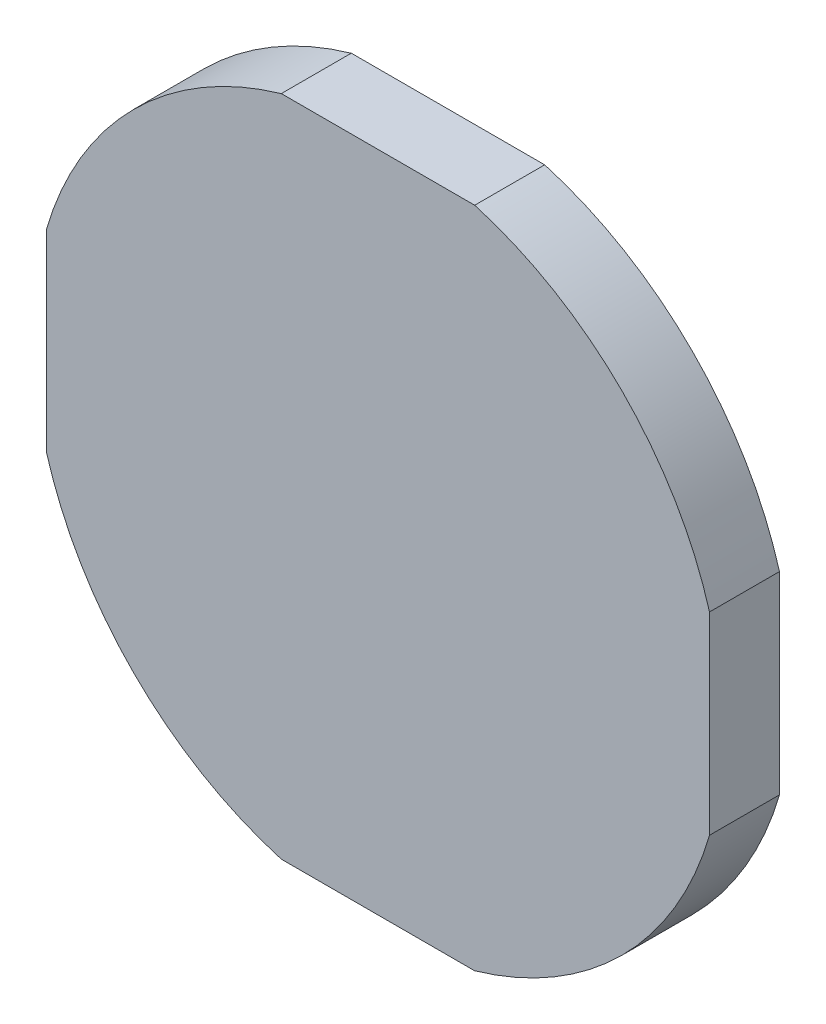
ISO-10303-21;
HEADER;
FILE_DESCRIPTION(('STEP AP214'),'2;1');
FILE_NAME('part.step','',(''),(''),'','','');
FILE_SCHEMA(('AUTOMOTIVE_DESIGN { 1 0 10303 214 1 1 1 1 }'));
ENDSEC;
DATA;
#1=APPLICATION_CONTEXT('core data for automotive mechanical design processes');
#2=APPLICATION_PROTOCOL_DEFINITION('international standard','automotive_design',2000,#1);
#3=PRODUCT_CONTEXT('',#1,'mechanical');
#4=PRODUCT('Part','Part','',(#3));
#5=PRODUCT_RELATED_PRODUCT_CATEGORY('part','',(#4));
#6=PRODUCT_DEFINITION_FORMATION('','',#4);
#7=PRODUCT_DEFINITION_CONTEXT('part definition',#1,'design');
#8=PRODUCT_DEFINITION('design','',#6,#7);
#9=PRODUCT_DEFINITION_SHAPE('','',#8);
#10=(LENGTH_UNIT() NAMED_UNIT(*) SI_UNIT(.MILLI.,.METRE.));
#11=(NAMED_UNIT(*) PLANE_ANGLE_UNIT() SI_UNIT($,.RADIAN.));
#12=(NAMED_UNIT(*) SI_UNIT($,.STERADIAN.) SOLID_ANGLE_UNIT());
#13=UNCERTAINTY_MEASURE_WITH_UNIT(LENGTH_MEASURE(1.E-05),#10,'distance_accuracy_value','');
#14=(GEOMETRIC_REPRESENTATION_CONTEXT(3) GLOBAL_UNCERTAINTY_ASSIGNED_CONTEXT((#13)) GLOBAL_UNIT_ASSIGNED_CONTEXT((#10,
#11,#12)) REPRESENTATION_CONTEXT('',''));
#15=CARTESIAN_POINT('',(0.,0.,0.));
#16=DIRECTION('',(0.,0.,1.));
#17=DIRECTION('',(1.,0.,0.));
#18=AXIS2_PLACEMENT_3D('',#15,#16,#17);
#19=CARTESIAN_POINT('',(0.,0.,-0.9652));
#20=DIRECTION('',(0.,0.,1.));
#21=DIRECTION('',(1.,0.,0.));
#22=AXIS2_PLACEMENT_3D('',#19,#20,#21);
#23=CYLINDRICAL_SURFACE('',#22,4.7625);
#24=CARTESIAN_POINT('',(0.,0.,0.));
#25=DIRECTION('',(0.,0.,1.));
#26=DIRECTION('',(1.,0.,0.));
#27=AXIS2_PLACEMENT_3D('',#24,#25,#26);
#28=CIRCLE('',#27,4.7625);
#29=CARTESIAN_POINT('',(-1.33350000000004,4.572,0.));
#30=VERTEX_POINT('',#29);
#31=CARTESIAN_POINT('',(-4.57199999999999,1.33350000000004,0.));
#32=VERTEX_POINT('',#31);
#33=EDGE_CURVE('E573',#30,#32,#28,.T.);
#34=ORIENTED_EDGE('',*,*,#33,.F.);
#35=DIRECTION('',(0.,0.,1.));
#36=VECTOR('',#35,1.);
#37=CARTESIAN_POINT('',(-1.33350000000004,4.572,-0.9652));
#38=LINE('',#37,#36);
#39=CARTESIAN_POINT('',(-1.33350000000004,4.572,-0.9652));
#40=VERTEX_POINT('',#39);
#41=EDGE_CURVE('E11',#40,#30,#38,.T.);
#42=ORIENTED_EDGE('',*,*,#41,.F.);
#43=CARTESIAN_POINT('',(0.,0.,-0.9652));
#44=DIRECTION('',(0.,0.,1.));
#45=DIRECTION('',(1.,0.,0.));
#46=AXIS2_PLACEMENT_3D('',#43,#44,#45);
#47=CIRCLE('',#46,4.7625);
#48=CARTESIAN_POINT('',(-4.57199999999999,1.33350000000004,-0.9652));
#49=VERTEX_POINT('',#48);
#50=EDGE_CURVE('E583',#40,#49,#47,.T.);
#51=ORIENTED_EDGE('',*,*,#50,.T.);
#52=DIRECTION('',(0.,0.,1.));
#53=VECTOR('',#52,1.);
#54=CARTESIAN_POINT('',(-4.57199999999999,1.33350000000004,-0.9652));
#55=LINE('',#54,#53);
#56=EDGE_CURVE('E43',#49,#32,#55,.T.);
#57=ORIENTED_EDGE('',*,*,#56,.T.);
#58=EDGE_LOOP('',(#34,#42,#51,#57));
#59=FACE_BOUND('',#58,.T.);
#60=ADVANCED_FACE('F40',(#59),#23,.T.);
#61=CARTESIAN_POINT('',(-1.33350000000004,4.572,-0.9652));
#62=DIRECTION('',(0.,1.,0.));
#63=DIRECTION('',(0.,0.,1.));
#64=AXIS2_PLACEMENT_3D('',#61,#62,#63);
#65=PLANE('',#64);
#66=DIRECTION('',(-1.,0.,0.));
#67=VECTOR('',#66,1.);
#68=CARTESIAN_POINT('',(-1.33350000000004,4.572,0.));
#69=LINE('',#68,#67);
#70=CARTESIAN_POINT('',(1.33350000000004,4.572,0.));
#71=VERTEX_POINT('',#70);
#72=EDGE_CURVE('E588',#71,#30,#69,.T.);
#73=ORIENTED_EDGE('',*,*,#72,.F.);
#74=DIRECTION('',(0.,0.,1.));
#75=VECTOR('',#74,1.);
#76=CARTESIAN_POINT('',(1.33350000000004,4.572,-0.9652));
#77=LINE('',#76,#75);
#78=CARTESIAN_POINT('',(1.33350000000004,4.572,-0.9652));
#79=VERTEX_POINT('',#78);
#80=EDGE_CURVE('E49',#79,#71,#77,.T.);
#81=ORIENTED_EDGE('',*,*,#80,.F.);
#82=DIRECTION('',(-1.,0.,0.));
#83=VECTOR('',#82,1.);
#84=CARTESIAN_POINT('',(-1.33350000000004,4.572,-0.9652));
#85=LINE('',#84,#83);
#86=EDGE_CURVE('E612',#79,#40,#85,.T.);
#87=ORIENTED_EDGE('',*,*,#86,.T.);
#88=ORIENTED_EDGE('',*,*,#41,.T.);
#89=EDGE_LOOP('',(#73,#81,#87,#88));
#90=FACE_BOUND('',#89,.T.);
#91=ADVANCED_FACE('F675',(#90),#65,.T.);
#92=CARTESIAN_POINT('',(0.,0.,-0.9652));
#93=DIRECTION('',(0.,0.,1.));
#94=DIRECTION('',(1.,0.,0.));
#95=AXIS2_PLACEMENT_3D('',#92,#93,#94);
#96=CYLINDRICAL_SURFACE('',#95,4.7625);
#97=CARTESIAN_POINT('',(0.,0.,0.));
#98=DIRECTION('',(0.,0.,1.));
#99=DIRECTION('',(1.,0.,0.));
#100=AXIS2_PLACEMENT_3D('',#97,#98,#99);
#101=CIRCLE('',#100,4.7625);
#102=CARTESIAN_POINT('',(4.57199999999999,1.33350000000004,0.));
#103=VERTEX_POINT('',#102);
#104=EDGE_CURVE('E639',#103,#71,#101,.T.);
#105=ORIENTED_EDGE('',*,*,#104,.F.);
#106=DIRECTION('',(0.,0.,1.));
#107=VECTOR('',#106,1.);
#108=CARTESIAN_POINT('',(4.57199999999999,1.33350000000004,-0.9652));
#109=LINE('',#108,#107);
#110=CARTESIAN_POINT('',(4.57199999999999,1.33350000000004,-0.9652));
#111=VERTEX_POINT('',#110);
#112=EDGE_CURVE('E648',#111,#103,#109,.T.);
#113=ORIENTED_EDGE('',*,*,#112,.F.);
#114=CARTESIAN_POINT('',(0.,0.,-0.9652));
#115=DIRECTION('',(0.,0.,1.));
#116=DIRECTION('',(1.,0.,0.));
#117=AXIS2_PLACEMENT_3D('',#114,#115,#116);
#118=CIRCLE('',#117,4.7625);
#119=EDGE_CURVE('E608',#111,#79,#118,.T.);
#120=ORIENTED_EDGE('',*,*,#119,.T.);
#121=ORIENTED_EDGE('',*,*,#80,.T.);
#122=EDGE_LOOP('',(#105,#113,#120,#121));
#123=FACE_BOUND('',#122,.T.);
#124=ADVANCED_FACE('F696',(#123),#96,.T.);
#125=CARTESIAN_POINT('',(4.57199999999999,1.33350000000004,-0.9652));
#126=DIRECTION('',(1.,0.,0.));
#127=DIRECTION('',(0.,0.,-1.));
#128=AXIS2_PLACEMENT_3D('',#125,#126,#127);
#129=PLANE('',#128);
#130=DIRECTION('',(0.,1.,0.));
#131=VECTOR('',#130,1.);
#132=CARTESIAN_POINT('',(4.57199999999999,1.33350000000004,0.));
#133=LINE('',#132,#131);
#134=CARTESIAN_POINT('',(4.57199999999999,-1.33350000000004,0.));
#135=VERTEX_POINT('',#134);
#136=EDGE_CURVE('E635',#135,#103,#133,.T.);
#137=ORIENTED_EDGE('',*,*,#136,.F.);
#138=DIRECTION('',(0.,0.,1.));
#139=VECTOR('',#138,1.);
#140=CARTESIAN_POINT('',(4.57199999999999,-1.33350000000004,-0.9652));
#141=LINE('',#140,#139);
#142=CARTESIAN_POINT('',(4.57199999999999,-1.33350000000004,-0.9652));
#143=VERTEX_POINT('',#142);
#144=EDGE_CURVE('E651',#143,#135,#141,.T.);
#145=ORIENTED_EDGE('',*,*,#144,.F.);
#146=DIRECTION('',(0.,1.,0.));
#147=VECTOR('',#146,1.);
#148=CARTESIAN_POINT('',(4.57199999999999,1.33350000000004,-0.9652));
#149=LINE('',#148,#147);
#150=EDGE_CURVE('E604',#143,#111,#149,.T.);
#151=ORIENTED_EDGE('',*,*,#150,.T.);
#152=ORIENTED_EDGE('',*,*,#112,.T.);
#153=EDGE_LOOP('',(#137,#145,#151,#152));
#154=FACE_BOUND('',#153,.T.);
#155=ADVANCED_FACE('F694',(#154),#129,.T.);
#156=CARTESIAN_POINT('',(0.,0.,-0.9652));
#157=DIRECTION('',(0.,0.,1.));
#158=DIRECTION('',(1.,0.,0.));
#159=AXIS2_PLACEMENT_3D('',#156,#157,#158);
#160=CYLINDRICAL_SURFACE('',#159,4.7625);
#161=CARTESIAN_POINT('',(0.,0.,0.));
#162=DIRECTION('',(0.,0.,1.));
#163=DIRECTION('',(1.,0.,0.));
#164=AXIS2_PLACEMENT_3D('',#161,#162,#163);
#165=CIRCLE('',#164,4.7625);
#166=CARTESIAN_POINT('',(1.33350000000003,-4.57199999999999,0.));
#167=VERTEX_POINT('',#166);
#168=EDGE_CURVE('E631',#167,#135,#165,.T.);
#169=ORIENTED_EDGE('',*,*,#168,.F.);
#170=DIRECTION('',(0.,0.,1.));
#171=VECTOR('',#170,1.);
#172=CARTESIAN_POINT('',(1.33350000000003,-4.57199999999999,-0.9652));
#173=LINE('',#172,#171);
#174=CARTESIAN_POINT('',(1.33350000000003,-4.57199999999999,-0.9652));
#175=VERTEX_POINT('',#174);
#176=EDGE_CURVE('E654',#175,#167,#173,.T.);
#177=ORIENTED_EDGE('',*,*,#176,.F.);
#178=CARTESIAN_POINT('',(0.,0.,-0.9652));
#179=DIRECTION('',(0.,0.,1.));
#180=DIRECTION('',(1.,0.,0.));
#181=AXIS2_PLACEMENT_3D('',#178,#179,#180);
#182=CIRCLE('',#181,4.7625);
#183=EDGE_CURVE('E600',#175,#143,#182,.T.);
#184=ORIENTED_EDGE('',*,*,#183,.T.);
#185=ORIENTED_EDGE('',*,*,#144,.T.);
#186=EDGE_LOOP('',(#169,#177,#184,#185));
#187=FACE_BOUND('',#186,.T.);
#188=ADVANCED_FACE('F690',(#187),#160,.T.);
#189=CARTESIAN_POINT('',(1.33350000000004,-4.572,-0.9652));
#190=DIRECTION('',(0.,-1.,0.));
#191=DIRECTION('',(0.,0.,-1.));
#192=AXIS2_PLACEMENT_3D('',#189,#190,#191);
#193=PLANE('',#192);
#194=DIRECTION('',(1.,0.,0.));
#195=VECTOR('',#194,1.);
#196=CARTESIAN_POINT('',(1.33350000000004,-4.572,0.));
#197=LINE('',#196,#195);
#198=CARTESIAN_POINT('',(-1.33350000000004,-4.572,0.));
#199=VERTEX_POINT('',#198);
#200=EDGE_CURVE('E627',#199,#167,#197,.T.);
#201=ORIENTED_EDGE('',*,*,#200,.F.);
#202=DIRECTION('',(0.,0.,1.));
#203=VECTOR('',#202,1.);
#204=CARTESIAN_POINT('',(-1.33350000000004,-4.572,-0.9652));
#205=LINE('',#204,#203);
#206=CARTESIAN_POINT('',(-1.33350000000004,-4.572,-0.9652));
#207=VERTEX_POINT('',#206);
#208=EDGE_CURVE('E657',#207,#199,#205,.T.);
#209=ORIENTED_EDGE('',*,*,#208,.F.);
#210=DIRECTION('',(1.,0.,0.));
#211=VECTOR('',#210,1.);
#212=CARTESIAN_POINT('',(1.33350000000004,-4.572,-0.9652));
#213=LINE('',#212,#211);
#214=EDGE_CURVE('E596',#207,#175,#213,.T.);
#215=ORIENTED_EDGE('',*,*,#214,.T.);
#216=ORIENTED_EDGE('',*,*,#176,.T.);
#217=EDGE_LOOP('',(#201,#209,#215,#216));
#218=FACE_BOUND('',#217,.T.);
#219=ADVANCED_FACE('F688',(#218),#193,.T.);
#220=CARTESIAN_POINT('',(0.,0.,-0.9652));
#221=DIRECTION('',(0.,0.,1.));
#222=DIRECTION('',(1.,0.,0.));
#223=AXIS2_PLACEMENT_3D('',#220,#221,#222);
#224=CYLINDRICAL_SURFACE('',#223,4.7625);
#225=CARTESIAN_POINT('',(0.,0.,0.));
#226=DIRECTION('',(0.,0.,1.));
#227=DIRECTION('',(1.,0.,0.));
#228=AXIS2_PLACEMENT_3D('',#225,#226,#227);
#229=CIRCLE('',#228,4.7625);
#230=CARTESIAN_POINT('',(-4.57199999999999,-1.33350000000004,0.));
#231=VERTEX_POINT('',#230);
#232=EDGE_CURVE('E623',#231,#199,#229,.T.);
#233=ORIENTED_EDGE('',*,*,#232,.F.);
#234=DIRECTION('',(0.,0.,1.));
#235=VECTOR('',#234,1.);
#236=CARTESIAN_POINT('',(-4.57199999999999,-1.33350000000004,-0.9652));
#237=LINE('',#236,#235);
#238=CARTESIAN_POINT('',(-4.57199999999999,-1.33350000000004,-0.9652));
#239=VERTEX_POINT('',#238);
#240=EDGE_CURVE('E659',#239,#231,#237,.T.);
#241=ORIENTED_EDGE('',*,*,#240,.F.);
#242=CARTESIAN_POINT('',(0.,0.,-0.9652));
#243=DIRECTION('',(0.,0.,1.));
#244=DIRECTION('',(1.,0.,0.));
#245=AXIS2_PLACEMENT_3D('',#242,#243,#244);
#246=CIRCLE('',#245,4.7625);
#247=EDGE_CURVE('E592',#239,#207,#246,.T.);
#248=ORIENTED_EDGE('',*,*,#247,.T.);
#249=ORIENTED_EDGE('',*,*,#208,.T.);
#250=EDGE_LOOP('',(#233,#241,#248,#249));
#251=FACE_BOUND('',#250,.T.);
#252=ADVANCED_FACE('F684',(#251),#224,.T.);
#253=CARTESIAN_POINT('',(-4.57199999999999,1.33350000000004,-0.9652));
#254=DIRECTION('',(-1.,0.,0.));
#255=DIRECTION('',(0.,0.,1.));
#256=AXIS2_PLACEMENT_3D('',#253,#254,#255);
#257=PLANE('',#256);
#258=DIRECTION('',(0.,-1.,0.));
#259=VECTOR('',#258,1.);
#260=CARTESIAN_POINT('',(-4.57199999999999,1.33350000000004,0.));
#261=LINE('',#260,#259);
#262=EDGE_CURVE('E619',#32,#231,#261,.T.);
#263=ORIENTED_EDGE('',*,*,#262,.F.);
#264=ORIENTED_EDGE('',*,*,#56,.F.);
#265=DIRECTION('',(0.,-1.,0.));
#266=VECTOR('',#265,1.);
#267=CARTESIAN_POINT('',(-4.57199999999999,1.33350000000004,-0.9652));
#268=LINE('',#267,#266);
#269=EDGE_CURVE('E587',#49,#239,#268,.T.);
#270=ORIENTED_EDGE('',*,*,#269,.T.);
#271=ORIENTED_EDGE('',*,*,#240,.T.);
#272=EDGE_LOOP('',(#263,#264,#270,#271));
#273=FACE_BOUND('',#272,.T.);
#274=ADVANCED_FACE('F669',(#273),#257,.T.);
#275=CARTESIAN_POINT('',(0.,0.,-0.9652));
#276=DIRECTION('',(0.,0.,1.));
#277=DIRECTION('',(1.,0.,0.));
#278=AXIS2_PLACEMENT_3D('',#275,#276,#277);
#279=PLANE('',#278);
#280=DIRECTION('',(-1.,0.,0.));
#281=VECTOR('',#280,1.);
#282=CARTESIAN_POINT('',(-1.375,-3.125,-0.9652));
#283=LINE('',#282,#281);
#284=CARTESIAN_POINT('',(-1.375,-3.125,-0.9652));
#285=VERTEX_POINT('',#284);
#286=CARTESIAN_POINT('',(-2.625,-3.125,-0.9652));
#287=VERTEX_POINT('',#286);
#288=EDGE_CURVE('E351',#285,#287,#283,.T.);
#289=ORIENTED_EDGE('',*,*,#288,.F.);
#290=DIRECTION('',(0.,-1.,0.));
#291=VECTOR('',#290,1.);
#292=CARTESIAN_POINT('',(-1.375,-0.625,-0.9652));
#293=LINE('',#292,#291);
#294=CARTESIAN_POINT('',(-1.375,-0.625,-0.9652));
#295=VERTEX_POINT('',#294);
#296=EDGE_CURVE('E60',#295,#285,#293,.T.);
#297=ORIENTED_EDGE('',*,*,#296,.F.);
#298=DIRECTION('',(1.,0.,0.));
#299=VECTOR('',#298,1.);
#300=CARTESIAN_POINT('',(-1.375,-0.625,-0.9652));
#301=LINE('',#300,#299);
#302=CARTESIAN_POINT('',(-2.625,-0.625,-0.9652));
#303=VERTEX_POINT('',#302);
#304=EDGE_CURVE('E337',#303,#295,#301,.T.);
#305=ORIENTED_EDGE('',*,*,#304,.F.);
#306=DIRECTION('',(0.,1.,0.));
#307=VECTOR('',#306,1.);
#308=CARTESIAN_POINT('',(-2.625,-0.625,-0.9652));
#309=LINE('',#308,#307);
#310=EDGE_CURVE('E343',#287,#303,#309,.T.);
#311=ORIENTED_EDGE('',*,*,#310,.F.);
#312=EDGE_LOOP('',(#289,#297,#305,#311));
#313=FACE_BOUND('',#312,.T.);
#314=DIRECTION('',(-1.,0.,0.));
#315=VECTOR('',#314,1.);
#316=CARTESIAN_POINT('',(0.625,-3.125,-0.9652));
#317=LINE('',#316,#315);
#318=CARTESIAN_POINT('',(0.625,-3.125,-0.9652));
#319=VERTEX_POINT('',#318);
#320=CARTESIAN_POINT('',(-0.625000000000001,-3.125,-0.9652));
#321=VERTEX_POINT('',#320);
#322=EDGE_CURVE('E385',#319,#321,#317,.T.);
#323=ORIENTED_EDGE('',*,*,#322,.F.);
#324=DIRECTION('',(0.,-1.,0.));
#325=VECTOR('',#324,1.);
#326=CARTESIAN_POINT('',(0.624999999999999,-0.625,-0.9652));
#327=LINE('',#326,#325);
#328=CARTESIAN_POINT('',(0.624999999999999,-0.625,-0.9652));
#329=VERTEX_POINT('',#328);
#330=EDGE_CURVE('E71',#329,#319,#327,.T.);
#331=ORIENTED_EDGE('',*,*,#330,.F.);
#332=DIRECTION('',(1.,0.,0.));
#333=VECTOR('',#332,1.);
#334=CARTESIAN_POINT('',(0.624999999999999,-0.625,-0.9652));
#335=LINE('',#334,#333);
#336=CARTESIAN_POINT('',(-0.624999999999999,-0.625,-0.9652));
#337=VERTEX_POINT('',#336);
#338=EDGE_CURVE('E370',#337,#329,#335,.T.);
#339=ORIENTED_EDGE('',*,*,#338,.F.);
#340=DIRECTION('',(0.,1.,0.));
#341=VECTOR('',#340,1.);
#342=CARTESIAN_POINT('',(-0.624999999999999,-0.625,-0.9652));
#343=LINE('',#342,#341);
#344=EDGE_CURVE('E389',#321,#337,#343,.T.);
#345=ORIENTED_EDGE('',*,*,#344,.F.);
#346=EDGE_LOOP('',(#323,#331,#339,#345));
#347=FACE_BOUND('',#346,.T.);
#348=DIRECTION('',(-1.,0.,0.));
#349=VECTOR('',#348,1.);
#350=CARTESIAN_POINT('',(2.625,-3.125,-0.9652));
#351=LINE('',#350,#349);
#352=CARTESIAN_POINT('',(2.625,-3.125,-0.9652));
#353=VERTEX_POINT('',#352);
#354=CARTESIAN_POINT('',(1.375,-3.125,-0.9652));
#355=VERTEX_POINT('',#354);
#356=EDGE_CURVE('E428',#353,#355,#351,.T.);
#357=ORIENTED_EDGE('',*,*,#356,.F.);
#358=DIRECTION('',(0.,-1.,0.));
#359=VECTOR('',#358,1.);
#360=CARTESIAN_POINT('',(2.625,-0.625,-0.9652));
#361=LINE('',#360,#359);
#362=CARTESIAN_POINT('',(2.625,-0.625,-0.9652));
#363=VERTEX_POINT('',#362);
#364=EDGE_CURVE('E399',#363,#353,#361,.T.);
#365=ORIENTED_EDGE('',*,*,#364,.F.);
#366=DIRECTION('',(1.,0.,0.));
#367=VECTOR('',#366,1.);
#368=CARTESIAN_POINT('',(2.625,-0.625,-0.9652));
#369=LINE('',#368,#367);
#370=CARTESIAN_POINT('',(1.375,-0.625,-0.9652));
#371=VERTEX_POINT('',#370);
#372=EDGE_CURVE('E413',#371,#363,#369,.T.);
#373=ORIENTED_EDGE('',*,*,#372,.F.);
#374=DIRECTION('',(0.,1.,0.));
#375=VECTOR('',#374,1.);
#376=CARTESIAN_POINT('',(1.375,-0.625,-0.9652));
#377=LINE('',#376,#375);
#378=EDGE_CURVE('E432',#355,#371,#377,.T.);
#379=ORIENTED_EDGE('',*,*,#378,.F.);
#380=EDGE_LOOP('',(#357,#365,#373,#379));
#381=FACE_BOUND('',#380,.T.);
#382=DIRECTION('',(-1.,0.,0.));
#383=VECTOR('',#382,1.);
#384=CARTESIAN_POINT('',(-1.375,0.625,-0.9652));
#385=LINE('',#384,#383);
#386=CARTESIAN_POINT('',(-1.375,0.625,-0.9652));
#387=VERTEX_POINT('',#386);
#388=CARTESIAN_POINT('',(-2.625,0.625,-0.9652));
#389=VERTEX_POINT('',#388);
#390=EDGE_CURVE('E472',#387,#389,#385,.T.);
#391=ORIENTED_EDGE('',*,*,#390,.F.);
#392=DIRECTION('',(0.,-1.,0.));
#393=VECTOR('',#392,1.);
#394=CARTESIAN_POINT('',(-1.375,3.125,-0.9652));
#395=LINE('',#394,#393);
#396=CARTESIAN_POINT('',(-1.375,3.125,-0.9652));
#397=VERTEX_POINT('',#396);
#398=EDGE_CURVE('E442',#397,#387,#395,.T.);
#399=ORIENTED_EDGE('',*,*,#398,.F.);
#400=DIRECTION('',(1.,0.,0.));
#401=VECTOR('',#400,1.);
#402=CARTESIAN_POINT('',(-1.375,3.125,-0.9652));
#403=LINE('',#402,#401);
#404=CARTESIAN_POINT('',(-2.625,3.125,-0.9652));
#405=VERTEX_POINT('',#404);
#406=EDGE_CURVE('E457',#405,#397,#403,.T.);
#407=ORIENTED_EDGE('',*,*,#406,.F.);
#408=DIRECTION('',(0.,1.,0.));
#409=VECTOR('',#408,1.);
#410=CARTESIAN_POINT('',(-2.625,3.125,-0.9652));
#411=LINE('',#410,#409);
#412=EDGE_CURVE('E476',#389,#405,#411,.T.);
#413=ORIENTED_EDGE('',*,*,#412,.F.);
#414=EDGE_LOOP('',(#391,#399,#407,#413));
#415=FACE_BOUND('',#414,.T.);
#416=DIRECTION('',(-1.,0.,0.));
#417=VECTOR('',#416,1.);
#418=CARTESIAN_POINT('',(0.625,0.625,-0.9652));
#419=LINE('',#418,#417);
#420=CARTESIAN_POINT('',(0.625,0.625,-0.9652));
#421=VERTEX_POINT('',#420);
#422=CARTESIAN_POINT('',(-0.625,0.625,-0.9652));
#423=VERTEX_POINT('',#422);
#424=EDGE_CURVE('E516',#421,#423,#419,.T.);
#425=ORIENTED_EDGE('',*,*,#424,.F.);
#426=DIRECTION('',(0.,-1.,0.));
#427=VECTOR('',#426,1.);
#428=CARTESIAN_POINT('',(0.625,3.125,-0.9652));
#429=LINE('',#428,#427);
#430=CARTESIAN_POINT('',(0.625,3.125,-0.9652));
#431=VERTEX_POINT('',#430);
#432=EDGE_CURVE('E486',#431,#421,#429,.T.);
#433=ORIENTED_EDGE('',*,*,#432,.F.);
#434=DIRECTION('',(1.,0.,0.));
#435=VECTOR('',#434,1.);
#436=CARTESIAN_POINT('',(0.625,3.125,-0.9652));
#437=LINE('',#436,#435);
#438=CARTESIAN_POINT('',(-0.624999999999999,3.125,-0.9652));
#439=VERTEX_POINT('',#438);
#440=EDGE_CURVE('E501',#439,#431,#437,.T.);
#441=ORIENTED_EDGE('',*,*,#440,.F.);
#442=DIRECTION('',(0.,1.,0.));
#443=VECTOR('',#442,1.);
#444=CARTESIAN_POINT('',(-0.624999999999999,3.125,-0.9652));
#445=LINE('',#444,#443);
#446=EDGE_CURVE('E520',#423,#439,#445,.T.);
#447=ORIENTED_EDGE('',*,*,#446,.F.);
#448=EDGE_LOOP('',(#425,#433,#441,#447));
#449=FACE_BOUND('',#448,.T.);
#450=DIRECTION('',(-1.,0.,0.));
#451=VECTOR('',#450,1.);
#452=CARTESIAN_POINT('',(2.625,0.625,-0.9652));
#453=LINE('',#452,#451);
#454=CARTESIAN_POINT('',(2.625,0.625,-0.9652));
#455=VERTEX_POINT('',#454);
#456=CARTESIAN_POINT('',(1.375,0.625,-0.9652));
#457=VERTEX_POINT('',#456);
#458=EDGE_CURVE('E559',#455,#457,#453,.T.);
#459=ORIENTED_EDGE('',*,*,#458,.F.);
#460=DIRECTION('',(0.,-1.,0.));
#461=VECTOR('',#460,1.);
#462=CARTESIAN_POINT('',(2.625,3.125,-0.9652));
#463=LINE('',#462,#461);
#464=CARTESIAN_POINT('',(2.625,3.125,-0.9652));
#465=VERTEX_POINT('',#464);
#466=EDGE_CURVE('E530',#465,#455,#463,.T.);
#467=ORIENTED_EDGE('',*,*,#466,.F.);
#468=DIRECTION('',(1.,0.,0.));
#469=VECTOR('',#468,1.);
#470=CARTESIAN_POINT('',(2.625,3.125,-0.9652));
#471=LINE('',#470,#469);
#472=CARTESIAN_POINT('',(1.375,3.125,-0.9652));
#473=VERTEX_POINT('',#472);
#474=EDGE_CURVE('E544',#473,#465,#471,.T.);
#475=ORIENTED_EDGE('',*,*,#474,.F.);
#476=DIRECTION('',(0.,1.,0.));
#477=VECTOR('',#476,1.);
#478=CARTESIAN_POINT('',(1.375,3.125,-0.9652));
#479=LINE('',#478,#477);
#480=EDGE_CURVE('E563',#457,#473,#479,.T.);
#481=ORIENTED_EDGE('',*,*,#480,.F.);
#482=EDGE_LOOP('',(#459,#467,#475,#481));
#483=FACE_BOUND('',#482,.T.);
#484=ORIENTED_EDGE('',*,*,#50,.F.);
#485=ORIENTED_EDGE('',*,*,#86,.F.);
#486=ORIENTED_EDGE('',*,*,#119,.F.);
#487=ORIENTED_EDGE('',*,*,#150,.F.);
#488=ORIENTED_EDGE('',*,*,#183,.F.);
#489=ORIENTED_EDGE('',*,*,#214,.F.);
#490=ORIENTED_EDGE('',*,*,#247,.F.);
#491=ORIENTED_EDGE('',*,*,#269,.F.);
#492=EDGE_LOOP('',(#484,#485,#486,#487,#488,#489,#490,#491));
#493=FACE_BOUND('',#492,.T.);
#494=ADVANCED_FACE('F678',(#313,#347,#381,#415,#449,#483,#493),#279,.F.);
#495=CARTESIAN_POINT('',(0.,0.,0.));
#496=DIRECTION('',(0.,0.,1.));
#497=DIRECTION('',(1.,0.,0.));
#498=AXIS2_PLACEMENT_3D('',#495,#496,#497);
#499=PLANE('',#498);
#500=ORIENTED_EDGE('',*,*,#33,.T.);
#501=ORIENTED_EDGE('',*,*,#262,.T.);
#502=ORIENTED_EDGE('',*,*,#232,.T.);
#503=ORIENTED_EDGE('',*,*,#200,.T.);
#504=ORIENTED_EDGE('',*,*,#168,.T.);
#505=ORIENTED_EDGE('',*,*,#136,.T.);
#506=ORIENTED_EDGE('',*,*,#104,.T.);
#507=ORIENTED_EDGE('',*,*,#72,.T.);
#508=EDGE_LOOP('',(#500,#501,#502,#503,#504,#505,#506,#507));
#509=FACE_BOUND('',#508,.T.);
#510=ADVANCED_FACE('F671',(#509),#499,.T.);
#511=CARTESIAN_POINT('',(2.625,3.125,-0.9398));
#512=DIRECTION('',(1.,0.,0.));
#513=DIRECTION('',(0.,0.,-1.));
#514=AXIS2_PLACEMENT_3D('',#511,#512,#513);
#515=PLANE('',#514);
#516=ORIENTED_EDGE('',*,*,#466,.T.);
#517=DIRECTION('',(0.,0.,-1.));
#518=VECTOR('',#517,1.);
#519=CARTESIAN_POINT('',(2.625,0.625,-0.9398));
#520=LINE('',#519,#518);
#521=CARTESIAN_POINT('',(2.625,0.625,-0.9398));
#522=VERTEX_POINT('',#521);
#523=EDGE_CURVE('E556',#522,#455,#520,.T.);
#524=ORIENTED_EDGE('',*,*,#523,.F.);
#525=DIRECTION('',(0.,-1.,0.));
#526=VECTOR('',#525,1.);
#527=CARTESIAN_POINT('',(2.625,3.125,-0.9398));
#528=LINE('',#527,#526);
#529=CARTESIAN_POINT('',(2.625,3.125,-0.9398));
#530=VERTEX_POINT('',#529);
#531=EDGE_CURVE('E539',#530,#522,#528,.T.);
#532=ORIENTED_EDGE('',*,*,#531,.F.);
#533=DIRECTION('',(0.,0.,-1.));
#534=VECTOR('',#533,1.);
#535=CARTESIAN_POINT('',(2.625,3.125,-0.9398));
#536=LINE('',#535,#534);
#537=EDGE_CURVE('E570',#530,#465,#536,.T.);
#538=ORIENTED_EDGE('',*,*,#537,.T.);
#539=EDGE_LOOP('',(#516,#524,#532,#538));
#540=FACE_BOUND('',#539,.T.);
#541=ADVANCED_FACE('F767',(#540),#515,.F.);
#542=CARTESIAN_POINT('',(2.625,3.125,-0.9398));
#543=DIRECTION('',(0.,1.,0.));
#544=DIRECTION('',(0.,0.,1.));
#545=AXIS2_PLACEMENT_3D('',#542,#543,#544);
#546=PLANE('',#545);
#547=ORIENTED_EDGE('',*,*,#474,.T.);
#548=ORIENTED_EDGE('',*,*,#537,.F.);
#549=DIRECTION('',(1.,0.,0.));
#550=VECTOR('',#549,1.);
#551=CARTESIAN_POINT('',(2.625,3.125,-0.9398));
#552=LINE('',#551,#550);
#553=CARTESIAN_POINT('',(1.375,3.125,-0.9398));
#554=VERTEX_POINT('',#553);
#555=EDGE_CURVE('E552',#554,#530,#552,.T.);
#556=ORIENTED_EDGE('',*,*,#555,.F.);
#557=DIRECTION('',(0.,0.,-1.));
#558=VECTOR('',#557,1.);
#559=CARTESIAN_POINT('',(1.375,3.125,-0.9398));
#560=LINE('',#559,#558);
#561=EDGE_CURVE('E574',#554,#473,#560,.T.);
#562=ORIENTED_EDGE('',*,*,#561,.T.);
#563=EDGE_LOOP('',(#547,#548,#556,#562));
#564=FACE_BOUND('',#563,.T.);
#565=ADVANCED_FACE('F782',(#564),#546,.F.);
#566=CARTESIAN_POINT('',(1.375,3.125,-0.9398));
#567=DIRECTION('',(-1.,0.,0.));
#568=DIRECTION('',(0.,0.,1.));
#569=AXIS2_PLACEMENT_3D('',#566,#567,#568);
#570=PLANE('',#569);
#571=ORIENTED_EDGE('',*,*,#480,.T.);
#572=ORIENTED_EDGE('',*,*,#561,.F.);
#573=DIRECTION('',(0.,1.,0.));
#574=VECTOR('',#573,1.);
#575=CARTESIAN_POINT('',(1.375,3.125,-0.9398));
#576=LINE('',#575,#574);
#577=CARTESIAN_POINT('',(1.375,0.625,-0.9398));
#578=VERTEX_POINT('',#577);
#579=EDGE_CURVE('E548',#578,#554,#576,.T.);
#580=ORIENTED_EDGE('',*,*,#579,.F.);
#581=DIRECTION('',(0.,0.,-1.));
#582=VECTOR('',#581,1.);
#583=CARTESIAN_POINT('',(1.375,0.625,-0.9398));
#584=LINE('',#583,#582);
#585=EDGE_CURVE('E577',#578,#457,#584,.T.);
#586=ORIENTED_EDGE('',*,*,#585,.T.);
#587=EDGE_LOOP('',(#571,#572,#580,#586));
#588=FACE_BOUND('',#587,.T.);
#589=ADVANCED_FACE('F792',(#588),#570,.F.);
#590=CARTESIAN_POINT('',(2.625,0.625,-0.9398));
#591=DIRECTION('',(0.,-1.,0.));
#592=DIRECTION('',(0.,0.,-1.));
#593=AXIS2_PLACEMENT_3D('',#590,#591,#592);
#594=PLANE('',#593);
#595=ORIENTED_EDGE('',*,*,#458,.T.);
#596=ORIENTED_EDGE('',*,*,#585,.F.);
#597=DIRECTION('',(-1.,0.,0.));
#598=VECTOR('',#597,1.);
#599=CARTESIAN_POINT('',(2.625,0.625,-0.9398));
#600=LINE('',#599,#598);
#601=EDGE_CURVE('E543',#522,#578,#600,.T.);
#602=ORIENTED_EDGE('',*,*,#601,.F.);
#603=ORIENTED_EDGE('',*,*,#523,.T.);
#604=EDGE_LOOP('',(#595,#596,#602,#603));
#605=FACE_BOUND('',#604,.T.);
#606=ADVANCED_FACE('F803',(#605),#594,.F.);
#607=CARTESIAN_POINT('',(0.,0.,-0.9398));
#608=DIRECTION('',(0.,0.,-1.));
#609=DIRECTION('',(-1.,0.,0.));
#610=AXIS2_PLACEMENT_3D('',#607,#608,#609);
#611=PLANE('',#610);
#612=ORIENTED_EDGE('',*,*,#531,.T.);
#613=ORIENTED_EDGE('',*,*,#601,.T.);
#614=ORIENTED_EDGE('',*,*,#579,.T.);
#615=ORIENTED_EDGE('',*,*,#555,.T.);
#616=EDGE_LOOP('',(#612,#613,#614,#615));
#617=FACE_BOUND('',#616,.T.);
#618=ADVANCED_FACE('F812',(#617),#611,.T.);
#619=CARTESIAN_POINT('',(0.625,3.125,-0.9398));
#620=DIRECTION('',(1.,0.,0.));
#621=DIRECTION('',(0.,1.,0.));
#622=AXIS2_PLACEMENT_3D('',#619,#620,#621);
#623=PLANE('',#622);
#624=ORIENTED_EDGE('',*,*,#432,.T.);
#625=DIRECTION('',(0.,0.,-1.));
#626=VECTOR('',#625,1.);
#627=CARTESIAN_POINT('',(0.625,0.625,-0.9398));
#628=LINE('',#627,#626);
#629=CARTESIAN_POINT('',(0.625,0.625,-0.9398));
#630=VERTEX_POINT('',#629);
#631=EDGE_CURVE('E513',#630,#421,#628,.T.);
#632=ORIENTED_EDGE('',*,*,#631,.F.);
#633=DIRECTION('',(0.,-1.,0.));
#634=VECTOR('',#633,1.);
#635=CARTESIAN_POINT('',(0.625,3.125,-0.9398));
#636=LINE('',#635,#634);
#637=CARTESIAN_POINT('',(0.625,3.125,-0.9398));
#638=VERTEX_POINT('',#637);
#639=EDGE_CURVE('E496',#638,#630,#636,.T.);
#640=ORIENTED_EDGE('',*,*,#639,.F.);
#641=DIRECTION('',(0.,0.,-1.));
#642=VECTOR('',#641,1.);
#643=CARTESIAN_POINT('',(0.625,3.125,-0.9398));
#644=LINE('',#643,#642);
#645=EDGE_CURVE('E527',#638,#431,#644,.T.);
#646=ORIENTED_EDGE('',*,*,#645,.T.);
#647=EDGE_LOOP('',(#624,#632,#640,#646));
#648=FACE_BOUND('',#647,.T.);
#649=ADVANCED_FACE('F822',(#648),#623,.F.);
#650=CARTESIAN_POINT('',(0.625,3.125,-0.9398));
#651=DIRECTION('',(0.,1.,0.));
#652=DIRECTION('',(0.,0.,1.));
#653=AXIS2_PLACEMENT_3D('',#650,#651,#652);
#654=PLANE('',#653);
#655=ORIENTED_EDGE('',*,*,#440,.T.);
#656=ORIENTED_EDGE('',*,*,#645,.F.);
#657=DIRECTION('',(1.,0.,0.));
#658=VECTOR('',#657,1.);
#659=CARTESIAN_POINT('',(0.625,3.125,-0.9398));
#660=LINE('',#659,#658);
#661=CARTESIAN_POINT('',(-0.624999999999999,3.125,-0.9398));
#662=VERTEX_POINT('',#661);
#663=EDGE_CURVE('E509',#662,#638,#660,.T.);
#664=ORIENTED_EDGE('',*,*,#663,.F.);
#665=DIRECTION('',(0.,0.,-1.));
#666=VECTOR('',#665,1.);
#667=CARTESIAN_POINT('',(-0.624999999999999,3.125,-0.9398));
#668=LINE('',#667,#666);
#669=EDGE_CURVE('E531',#662,#439,#668,.T.);
#670=ORIENTED_EDGE('',*,*,#669,.T.);
#671=EDGE_LOOP('',(#655,#656,#664,#670));
#672=FACE_BOUND('',#671,.T.);
#673=ADVANCED_FACE('F832',(#672),#654,.F.);
#674=CARTESIAN_POINT('',(-0.624999999999999,3.125,-0.9398));
#675=DIRECTION('',(-1.,0.,0.));
#676=DIRECTION('',(0.,-1.,0.));
#677=AXIS2_PLACEMENT_3D('',#674,#675,#676);
#678=PLANE('',#677);
#679=ORIENTED_EDGE('',*,*,#446,.T.);
#680=ORIENTED_EDGE('',*,*,#669,.F.);
#681=DIRECTION('',(0.,1.,0.));
#682=VECTOR('',#681,1.);
#683=CARTESIAN_POINT('',(-0.624999999999999,3.125,-0.9398));
#684=LINE('',#683,#682);
#685=CARTESIAN_POINT('',(-0.625,0.625,-0.9398));
#686=VERTEX_POINT('',#685);
#687=EDGE_CURVE('E505',#686,#662,#684,.T.);
#688=ORIENTED_EDGE('',*,*,#687,.F.);
#689=DIRECTION('',(0.,0.,-1.));
#690=VECTOR('',#689,1.);
#691=CARTESIAN_POINT('',(-0.625,0.625,-0.9398));
#692=LINE('',#691,#690);
#693=EDGE_CURVE('E534',#686,#423,#692,.T.);
#694=ORIENTED_EDGE('',*,*,#693,.T.);
#695=EDGE_LOOP('',(#679,#680,#688,#694));
#696=FACE_BOUND('',#695,.T.);
#697=ADVANCED_FACE('F842',(#696),#678,.F.);
#698=CARTESIAN_POINT('',(0.625,0.625,-0.9398));
#699=DIRECTION('',(0.,-1.,0.));
#700=DIRECTION('',(0.,0.,-1.));
#701=AXIS2_PLACEMENT_3D('',#698,#699,#700);
#702=PLANE('',#701);
#703=ORIENTED_EDGE('',*,*,#424,.T.);
#704=ORIENTED_EDGE('',*,*,#693,.F.);
#705=DIRECTION('',(-1.,0.,0.));
#706=VECTOR('',#705,1.);
#707=CARTESIAN_POINT('',(0.625,0.625,-0.9398));
#708=LINE('',#707,#706);
#709=EDGE_CURVE('E500',#630,#686,#708,.T.);
#710=ORIENTED_EDGE('',*,*,#709,.F.);
#711=ORIENTED_EDGE('',*,*,#631,.T.);
#712=EDGE_LOOP('',(#703,#704,#710,#711));
#713=FACE_BOUND('',#712,.T.);
#714=ADVANCED_FACE('F852',(#713),#702,.F.);
#715=CARTESIAN_POINT('',(0.,0.,-0.9398));
#716=DIRECTION('',(0.,0.,-1.));
#717=DIRECTION('',(-1.,0.,0.));
#718=AXIS2_PLACEMENT_3D('',#715,#716,#717);
#719=PLANE('',#718);
#720=ORIENTED_EDGE('',*,*,#639,.T.);
#721=ORIENTED_EDGE('',*,*,#709,.T.);
#722=ORIENTED_EDGE('',*,*,#687,.T.);
#723=ORIENTED_EDGE('',*,*,#663,.T.);
#724=EDGE_LOOP('',(#720,#721,#722,#723));
#725=FACE_BOUND('',#724,.T.);
#726=ADVANCED_FACE('F862',(#725),#719,.T.);
#727=CARTESIAN_POINT('',(-1.375,3.125,-0.9398));
#728=DIRECTION('',(1.,0.,0.));
#729=DIRECTION('',(0.,0.,-1.));
#730=AXIS2_PLACEMENT_3D('',#727,#728,#729);
#731=PLANE('',#730);
#732=ORIENTED_EDGE('',*,*,#398,.T.);
#733=DIRECTION('',(0.,0.,-1.));
#734=VECTOR('',#733,1.);
#735=CARTESIAN_POINT('',(-1.375,0.625,-0.9398));
#736=LINE('',#735,#734);
#737=CARTESIAN_POINT('',(-1.375,0.625,-0.9398));
#738=VERTEX_POINT('',#737);
#739=EDGE_CURVE('E469',#738,#387,#736,.T.);
#740=ORIENTED_EDGE('',*,*,#739,.F.);
#741=DIRECTION('',(0.,-1.,0.));
#742=VECTOR('',#741,1.);
#743=CARTESIAN_POINT('',(-1.375,3.125,-0.9398));
#744=LINE('',#743,#742);
#745=CARTESIAN_POINT('',(-1.375,3.125,-0.9398));
#746=VERTEX_POINT('',#745);
#747=EDGE_CURVE('E452',#746,#738,#744,.T.);
#748=ORIENTED_EDGE('',*,*,#747,.F.);
#749=DIRECTION('',(0.,0.,-1.));
#750=VECTOR('',#749,1.);
#751=CARTESIAN_POINT('',(-1.375,3.125,-0.9398));
#752=LINE('',#751,#750);
#753=EDGE_CURVE('E483',#746,#397,#752,.T.);
#754=ORIENTED_EDGE('',*,*,#753,.T.);
#755=EDGE_LOOP('',(#732,#740,#748,#754));
#756=FACE_BOUND('',#755,.T.);
#757=ADVANCED_FACE('F872',(#756),#731,.F.);
#758=CARTESIAN_POINT('',(-1.375,3.125,-0.9398));
#759=DIRECTION('',(0.,1.,0.));
#760=DIRECTION('',(0.,0.,1.));
#761=AXIS2_PLACEMENT_3D('',#758,#759,#760);
#762=PLANE('',#761);
#763=ORIENTED_EDGE('',*,*,#406,.T.);
#764=ORIENTED_EDGE('',*,*,#753,.F.);
#765=DIRECTION('',(1.,0.,0.));
#766=VECTOR('',#765,1.);
#767=CARTESIAN_POINT('',(-1.375,3.125,-0.9398));
#768=LINE('',#767,#766);
#769=CARTESIAN_POINT('',(-2.625,3.125,-0.9398));
#770=VERTEX_POINT('',#769);
#771=EDGE_CURVE('E465',#770,#746,#768,.T.);
#772=ORIENTED_EDGE('',*,*,#771,.F.);
#773=DIRECTION('',(0.,0.,-1.));
#774=VECTOR('',#773,1.);
#775=CARTESIAN_POINT('',(-2.625,3.125,-0.9398));
#776=LINE('',#775,#774);
#777=EDGE_CURVE('E487',#770,#405,#776,.T.);
#778=ORIENTED_EDGE('',*,*,#777,.T.);
#779=EDGE_LOOP('',(#763,#764,#772,#778));
#780=FACE_BOUND('',#779,.T.);
#781=ADVANCED_FACE('F881',(#780),#762,.F.);
#782=CARTESIAN_POINT('',(-2.625,3.125,-0.9398));
#783=DIRECTION('',(-1.,0.,0.));
#784=DIRECTION('',(0.,0.,1.));
#785=AXIS2_PLACEMENT_3D('',#782,#783,#784);
#786=PLANE('',#785);
#787=ORIENTED_EDGE('',*,*,#412,.T.);
#788=ORIENTED_EDGE('',*,*,#777,.F.);
#789=DIRECTION('',(0.,1.,0.));
#790=VECTOR('',#789,1.);
#791=CARTESIAN_POINT('',(-2.625,3.125,-0.9398));
#792=LINE('',#791,#790);
#793=CARTESIAN_POINT('',(-2.625,0.625,-0.9398));
#794=VERTEX_POINT('',#793);
#795=EDGE_CURVE('E461',#794,#770,#792,.T.);
#796=ORIENTED_EDGE('',*,*,#795,.F.);
#797=DIRECTION('',(0.,0.,-1.));
#798=VECTOR('',#797,1.);
#799=CARTESIAN_POINT('',(-2.625,0.625,-0.9398));
#800=LINE('',#799,#798);
#801=EDGE_CURVE('E490',#794,#389,#800,.T.);
#802=ORIENTED_EDGE('',*,*,#801,.T.);
#803=EDGE_LOOP('',(#787,#788,#796,#802));
#804=FACE_BOUND('',#803,.T.);
#805=ADVANCED_FACE('F891',(#804),#786,.F.);
#806=CARTESIAN_POINT('',(-1.375,0.625,-0.9398));
#807=DIRECTION('',(0.,-1.,0.));
#808=DIRECTION('',(1.,0.,0.));
#809=AXIS2_PLACEMENT_3D('',#806,#807,#808);
#810=PLANE('',#809);
#811=ORIENTED_EDGE('',*,*,#390,.T.);
#812=ORIENTED_EDGE('',*,*,#801,.F.);
#813=DIRECTION('',(-1.,0.,0.));
#814=VECTOR('',#813,1.);
#815=CARTESIAN_POINT('',(-1.375,0.625,-0.9398));
#816=LINE('',#815,#814);
#817=EDGE_CURVE('E456',#738,#794,#816,.T.);
#818=ORIENTED_EDGE('',*,*,#817,.F.);
#819=ORIENTED_EDGE('',*,*,#739,.T.);
#820=EDGE_LOOP('',(#811,#812,#818,#819));
#821=FACE_BOUND('',#820,.T.);
#822=ADVANCED_FACE('F901',(#821),#810,.F.);
#823=CARTESIAN_POINT('',(0.,0.,-0.9398));
#824=DIRECTION('',(0.,0.,-1.));
#825=DIRECTION('',(-1.,0.,0.));
#826=AXIS2_PLACEMENT_3D('',#823,#824,#825);
#827=PLANE('',#826);
#828=ORIENTED_EDGE('',*,*,#747,.T.);
#829=ORIENTED_EDGE('',*,*,#817,.T.);
#830=ORIENTED_EDGE('',*,*,#795,.T.);
#831=ORIENTED_EDGE('',*,*,#771,.T.);
#832=EDGE_LOOP('',(#828,#829,#830,#831));
#833=FACE_BOUND('',#832,.T.);
#834=ADVANCED_FACE('F911',(#833),#827,.T.);
#835=CARTESIAN_POINT('',(2.625,-0.625,-0.9398));
#836=DIRECTION('',(1.,0.,0.));
#837=DIRECTION('',(0.,0.,-1.));
#838=AXIS2_PLACEMENT_3D('',#835,#836,#837);
#839=PLANE('',#838);
#840=ORIENTED_EDGE('',*,*,#364,.T.);
#841=DIRECTION('',(0.,0.,-1.));
#842=VECTOR('',#841,1.);
#843=CARTESIAN_POINT('',(2.625,-3.125,-0.9398));
#844=LINE('',#843,#842);
#845=CARTESIAN_POINT('',(2.625,-3.125,-0.9398));
#846=VERTEX_POINT('',#845);
#847=EDGE_CURVE('E425',#846,#353,#844,.T.);
#848=ORIENTED_EDGE('',*,*,#847,.F.);
#849=DIRECTION('',(0.,-1.,0.));
#850=VECTOR('',#849,1.);
#851=CARTESIAN_POINT('',(2.625,-0.625,-0.9398));
#852=LINE('',#851,#850);
#853=CARTESIAN_POINT('',(2.625,-0.625,-0.9398));
#854=VERTEX_POINT('',#853);
#855=EDGE_CURVE('E408',#854,#846,#852,.T.);
#856=ORIENTED_EDGE('',*,*,#855,.F.);
#857=DIRECTION('',(0.,0.,-1.));
#858=VECTOR('',#857,1.);
#859=CARTESIAN_POINT('',(2.625,-0.625,-0.9398));
#860=LINE('',#859,#858);
#861=EDGE_CURVE('E439',#854,#363,#860,.T.);
#862=ORIENTED_EDGE('',*,*,#861,.T.);
#863=EDGE_LOOP('',(#840,#848,#856,#862));
#864=FACE_BOUND('',#863,.T.);
#865=ADVANCED_FACE('F921',(#864),#839,.F.);
#866=CARTESIAN_POINT('',(2.625,-0.625,-0.9398));
#867=DIRECTION('',(0.,1.,0.));
#868=DIRECTION('',(0.,0.,1.));
#869=AXIS2_PLACEMENT_3D('',#866,#867,#868);
#870=PLANE('',#869);
#871=ORIENTED_EDGE('',*,*,#372,.T.);
#872=ORIENTED_EDGE('',*,*,#861,.F.);
#873=DIRECTION('',(1.,0.,0.));
#874=VECTOR('',#873,1.);
#875=CARTESIAN_POINT('',(2.625,-0.625,-0.9398));
#876=LINE('',#875,#874);
#877=CARTESIAN_POINT('',(1.375,-0.625,-0.9398));
#878=VERTEX_POINT('',#877);
#879=EDGE_CURVE('E421',#878,#854,#876,.T.);
#880=ORIENTED_EDGE('',*,*,#879,.F.);
#881=DIRECTION('',(0.,0.,-1.));
#882=VECTOR('',#881,1.);
#883=CARTESIAN_POINT('',(1.375,-0.625,-0.9398));
#884=LINE('',#883,#882);
#885=EDGE_CURVE('E443',#878,#371,#884,.T.);
#886=ORIENTED_EDGE('',*,*,#885,.T.);
#887=EDGE_LOOP('',(#871,#872,#880,#886));
#888=FACE_BOUND('',#887,.T.);
#889=ADVANCED_FACE('F931',(#888),#870,.F.);
#890=CARTESIAN_POINT('',(1.375,-0.625,-0.9398));
#891=DIRECTION('',(-1.,0.,0.));
#892=DIRECTION('',(0.,0.,1.));
#893=AXIS2_PLACEMENT_3D('',#890,#891,#892);
#894=PLANE('',#893);
#895=ORIENTED_EDGE('',*,*,#378,.T.);
#896=ORIENTED_EDGE('',*,*,#885,.F.);
#897=DIRECTION('',(0.,1.,0.));
#898=VECTOR('',#897,1.);
#899=CARTESIAN_POINT('',(1.375,-0.625,-0.9398));
#900=LINE('',#899,#898);
#901=CARTESIAN_POINT('',(1.375,-3.125,-0.9398));
#902=VERTEX_POINT('',#901);
#903=EDGE_CURVE('E417',#902,#878,#900,.T.);
#904=ORIENTED_EDGE('',*,*,#903,.F.);
#905=DIRECTION('',(0.,0.,-1.));
#906=VECTOR('',#905,1.);
#907=CARTESIAN_POINT('',(1.375,-3.125,-0.9398));
#908=LINE('',#907,#906);
#909=EDGE_CURVE('E446',#902,#355,#908,.T.);
#910=ORIENTED_EDGE('',*,*,#909,.T.);
#911=EDGE_LOOP('',(#895,#896,#904,#910));
#912=FACE_BOUND('',#911,.T.);
#913=ADVANCED_FACE('F941',(#912),#894,.F.);
#914=CARTESIAN_POINT('',(2.625,-3.125,-0.9398));
#915=DIRECTION('',(0.,-1.,0.));
#916=DIRECTION('',(0.,0.,-1.));
#917=AXIS2_PLACEMENT_3D('',#914,#915,#916);
#918=PLANE('',#917);
#919=ORIENTED_EDGE('',*,*,#356,.T.);
#920=ORIENTED_EDGE('',*,*,#909,.F.);
#921=DIRECTION('',(-1.,0.,0.));
#922=VECTOR('',#921,1.);
#923=CARTESIAN_POINT('',(2.625,-3.125,-0.9398));
#924=LINE('',#923,#922);
#925=EDGE_CURVE('E412',#846,#902,#924,.T.);
#926=ORIENTED_EDGE('',*,*,#925,.F.);
#927=ORIENTED_EDGE('',*,*,#847,.T.);
#928=EDGE_LOOP('',(#919,#920,#926,#927));
#929=FACE_BOUND('',#928,.T.);
#930=ADVANCED_FACE('F951',(#929),#918,.F.);
#931=CARTESIAN_POINT('',(0.,0.,-0.9398));
#932=DIRECTION('',(0.,0.,-1.));
#933=DIRECTION('',(-1.,0.,0.));
#934=AXIS2_PLACEMENT_3D('',#931,#932,#933);
#935=PLANE('',#934);
#936=ORIENTED_EDGE('',*,*,#855,.T.);
#937=ORIENTED_EDGE('',*,*,#925,.T.);
#938=ORIENTED_EDGE('',*,*,#903,.T.);
#939=ORIENTED_EDGE('',*,*,#879,.T.);
#940=EDGE_LOOP('',(#936,#937,#938,#939));
#941=FACE_BOUND('',#940,.T.);
#942=ADVANCED_FACE('F961',(#941),#935,.T.);
#943=CARTESIAN_POINT('',(0.624999999999999,-0.625,-0.9398));
#944=DIRECTION('',(1.,0.,0.));
#945=DIRECTION('',(0.,1.,0.));
#946=AXIS2_PLACEMENT_3D('',#943,#944,#945);
#947=PLANE('',#946);
#948=ORIENTED_EDGE('',*,*,#330,.T.);
#949=DIRECTION('',(0.,0.,-1.));
#950=VECTOR('',#949,1.);
#951=CARTESIAN_POINT('',(0.625,-3.125,-0.9398));
#952=LINE('',#951,#950);
#953=CARTESIAN_POINT('',(0.625,-3.125,-0.9398));
#954=VERTEX_POINT('',#953);
#955=EDGE_CURVE('E382',#954,#319,#952,.T.);
#956=ORIENTED_EDGE('',*,*,#955,.F.);
#957=DIRECTION('',(0.,-1.,0.));
#958=VECTOR('',#957,1.);
#959=CARTESIAN_POINT('',(0.624999999999999,-0.625,-0.9398));
#960=LINE('',#959,#958);
#961=CARTESIAN_POINT('',(0.624999999999999,-0.625,-0.9398));
#962=VERTEX_POINT('',#961);
#963=EDGE_CURVE('E365',#962,#954,#960,.T.);
#964=ORIENTED_EDGE('',*,*,#963,.F.);
#965=DIRECTION('',(0.,0.,-1.));
#966=VECTOR('',#965,1.);
#967=CARTESIAN_POINT('',(0.624999999999999,-0.625,-0.9398));
#968=LINE('',#967,#966);
#969=EDGE_CURVE('E396',#962,#329,#968,.T.);
#970=ORIENTED_EDGE('',*,*,#969,.T.);
#971=EDGE_LOOP('',(#948,#956,#964,#970));
#972=FACE_BOUND('',#971,.T.);
#973=ADVANCED_FACE('F971',(#972),#947,.F.);
#974=CARTESIAN_POINT('',(0.624999999999999,-0.625,-0.9398));
#975=DIRECTION('',(0.,1.,0.));
#976=DIRECTION('',(0.,0.,1.));
#977=AXIS2_PLACEMENT_3D('',#974,#975,#976);
#978=PLANE('',#977);
#979=ORIENTED_EDGE('',*,*,#338,.T.);
#980=ORIENTED_EDGE('',*,*,#969,.F.);
#981=DIRECTION('',(1.,0.,0.));
#982=VECTOR('',#981,1.);
#983=CARTESIAN_POINT('',(0.624999999999999,-0.625,-0.9398));
#984=LINE('',#983,#982);
#985=CARTESIAN_POINT('',(-0.624999999999999,-0.625,-0.9398));
#986=VERTEX_POINT('',#985);
#987=EDGE_CURVE('E378',#986,#962,#984,.T.);
#988=ORIENTED_EDGE('',*,*,#987,.F.);
#989=DIRECTION('',(0.,0.,-1.));
#990=VECTOR('',#989,1.);
#991=CARTESIAN_POINT('',(-0.624999999999999,-0.625,-0.9398));
#992=LINE('',#991,#990);
#993=EDGE_CURVE('E400',#986,#337,#992,.T.);
#994=ORIENTED_EDGE('',*,*,#993,.T.);
#995=EDGE_LOOP('',(#979,#980,#988,#994));
#996=FACE_BOUND('',#995,.T.);
#997=ADVANCED_FACE('F981',(#996),#978,.F.);
#998=CARTESIAN_POINT('',(-0.624999999999999,-0.625,-0.9398));
#999=DIRECTION('',(-1.,0.,0.));
#1000=DIRECTION('',(0.,-1.,0.));
#1001=AXIS2_PLACEMENT_3D('',#998,#999,#1000);
#1002=PLANE('',#1001);
#1003=ORIENTED_EDGE('',*,*,#344,.T.);
#1004=ORIENTED_EDGE('',*,*,#993,.F.);
#1005=DIRECTION('',(0.,1.,0.));
#1006=VECTOR('',#1005,1.);
#1007=CARTESIAN_POINT('',(-0.624999999999999,-0.625,-0.9398));
#1008=LINE('',#1007,#1006);
#1009=CARTESIAN_POINT('',(-0.625000000000001,-3.125,-0.9398));
#1010=VERTEX_POINT('',#1009);
#1011=EDGE_CURVE('E374',#1010,#986,#1008,.T.);
#1012=ORIENTED_EDGE('',*,*,#1011,.F.);
#1013=DIRECTION('',(0.,0.,-1.));
#1014=VECTOR('',#1013,1.);
#1015=CARTESIAN_POINT('',(-0.625000000000001,-3.125,-0.9398));
#1016=LINE('',#1015,#1014);
#1017=EDGE_CURVE('E403',#1010,#321,#1016,.T.);
#1018=ORIENTED_EDGE('',*,*,#1017,.T.);
#1019=EDGE_LOOP('',(#1003,#1004,#1012,#1018));
#1020=FACE_BOUND('',#1019,.T.);
#1021=ADVANCED_FACE('F990',(#1020),#1002,.F.);
#1022=CARTESIAN_POINT('',(0.625,-3.125,-0.9398));
#1023=DIRECTION('',(0.,-1.,0.));
#1024=DIRECTION('',(0.,0.,-1.));
#1025=AXIS2_PLACEMENT_3D('',#1022,#1023,#1024);
#1026=PLANE('',#1025);
#1027=ORIENTED_EDGE('',*,*,#322,.T.);
#1028=ORIENTED_EDGE('',*,*,#1017,.F.);
#1029=DIRECTION('',(-1.,0.,0.));
#1030=VECTOR('',#1029,1.);
#1031=CARTESIAN_POINT('',(0.625,-3.125,-0.9398));
#1032=LINE('',#1031,#1030);
#1033=EDGE_CURVE('E369',#954,#1010,#1032,.T.);
#1034=ORIENTED_EDGE('',*,*,#1033,.F.);
#1035=ORIENTED_EDGE('',*,*,#955,.T.);
#1036=EDGE_LOOP('',(#1027,#1028,#1034,#1035));
#1037=FACE_BOUND('',#1036,.T.);
#1038=ADVANCED_FACE('F1000',(#1037),#1026,.F.);
#1039=CARTESIAN_POINT('',(0.,0.,-0.9398));
#1040=DIRECTION('',(0.,0.,-1.));
#1041=DIRECTION('',(-1.,0.,0.));
#1042=AXIS2_PLACEMENT_3D('',#1039,#1040,#1041);
#1043=PLANE('',#1042);
#1044=ORIENTED_EDGE('',*,*,#963,.T.);
#1045=ORIENTED_EDGE('',*,*,#1033,.T.);
#1046=ORIENTED_EDGE('',*,*,#1011,.T.);
#1047=ORIENTED_EDGE('',*,*,#987,.T.);
#1048=EDGE_LOOP('',(#1044,#1045,#1046,#1047));
#1049=FACE_BOUND('',#1048,.T.);
#1050=ADVANCED_FACE('F1010',(#1049),#1043,.T.);
#1051=CARTESIAN_POINT('',(-1.375,-0.625,-0.9398));
#1052=DIRECTION('',(1.,0.,0.));
#1053=DIRECTION('',(0.,0.,-1.));
#1054=AXIS2_PLACEMENT_3D('',#1051,#1052,#1053);
#1055=PLANE('',#1054);
#1056=ORIENTED_EDGE('',*,*,#296,.T.);
#1057=DIRECTION('',(0.,0.,-1.));
#1058=VECTOR('',#1057,1.);
#1059=CARTESIAN_POINT('',(-1.375,-3.125,-0.9398));
#1060=LINE('',#1059,#1058);
#1061=CARTESIAN_POINT('',(-1.375,-3.125,-0.9398));
#1062=VERTEX_POINT('',#1061);
#1063=EDGE_CURVE('E312',#1062,#285,#1060,.T.);
#1064=ORIENTED_EDGE('',*,*,#1063,.F.);
#1065=DIRECTION('',(0.,-1.,0.));
#1066=VECTOR('',#1065,1.);
#1067=CARTESIAN_POINT('',(-1.375,-0.625,-0.9398));
#1068=LINE('',#1067,#1066);
#1069=CARTESIAN_POINT('',(-1.375,-0.625,-0.9398));
#1070=VERTEX_POINT('',#1069);
#1071=EDGE_CURVE('E316',#1070,#1062,#1068,.T.);
#1072=ORIENTED_EDGE('',*,*,#1071,.F.);
#1073=DIRECTION('',(0.,0.,-1.));
#1074=VECTOR('',#1073,1.);
#1075=CARTESIAN_POINT('',(-1.375,-0.625,-0.9398));
#1076=LINE('',#1075,#1074);
#1077=EDGE_CURVE('E357',#1070,#295,#1076,.T.);
#1078=ORIENTED_EDGE('',*,*,#1077,.T.);
#1079=EDGE_LOOP('',(#1056,#1064,#1072,#1078));
#1080=FACE_BOUND('',#1079,.T.);
#1081=ADVANCED_FACE('F314',(#1080),#1055,.F.);
#1082=CARTESIAN_POINT('',(-1.375,-0.625,-0.9398));
#1083=DIRECTION('',(0.,1.,0.));
#1084=DIRECTION('',(0.,0.,1.));
#1085=AXIS2_PLACEMENT_3D('',#1082,#1083,#1084);
#1086=PLANE('',#1085);
#1087=ORIENTED_EDGE('',*,*,#304,.T.);
#1088=ORIENTED_EDGE('',*,*,#1077,.F.);
#1089=DIRECTION('',(1.,0.,0.));
#1090=VECTOR('',#1089,1.);
#1091=CARTESIAN_POINT('',(-1.375,-0.625,-0.9398));
#1092=LINE('',#1091,#1090);
#1093=CARTESIAN_POINT('',(-2.625,-0.625,-0.9398));
#1094=VERTEX_POINT('',#1093);
#1095=EDGE_CURVE('E323',#1094,#1070,#1092,.T.);
#1096=ORIENTED_EDGE('',*,*,#1095,.F.);
#1097=DIRECTION('',(0.,0.,-1.));
#1098=VECTOR('',#1097,1.);
#1099=CARTESIAN_POINT('',(-2.625,-0.625,-0.9398));
#1100=LINE('',#1099,#1098);
#1101=EDGE_CURVE('E360',#1094,#303,#1100,.T.);
#1102=ORIENTED_EDGE('',*,*,#1101,.T.);
#1103=EDGE_LOOP('',(#1087,#1088,#1096,#1102));
#1104=FACE_BOUND('',#1103,.T.);
#1105=ADVANCED_FACE('F1029',(#1104),#1086,.F.);
#1106=CARTESIAN_POINT('',(-2.625,-0.625,-0.9398));
#1107=DIRECTION('',(-1.,0.,0.));
#1108=DIRECTION('',(0.,-1.,0.));
#1109=AXIS2_PLACEMENT_3D('',#1106,#1107,#1108);
#1110=PLANE('',#1109);
#1111=ORIENTED_EDGE('',*,*,#310,.T.);
#1112=ORIENTED_EDGE('',*,*,#1101,.F.);
#1113=DIRECTION('',(0.,1.,0.));
#1114=VECTOR('',#1113,1.);
#1115=CARTESIAN_POINT('',(-2.625,-0.625,-0.9398));
#1116=LINE('',#1115,#1114);
#1117=CARTESIAN_POINT('',(-2.625,-3.125,-0.9398));
#1118=VERTEX_POINT('',#1117);
#1119=EDGE_CURVE('E332',#1118,#1094,#1116,.T.);
#1120=ORIENTED_EDGE('',*,*,#1119,.F.);
#1121=DIRECTION('',(0.,0.,-1.));
#1122=VECTOR('',#1121,1.);
#1123=CARTESIAN_POINT('',(-2.625,-3.125,-0.9398));
#1124=LINE('',#1123,#1122);
#1125=EDGE_CURVE('E322',#1118,#287,#1124,.T.);
#1126=ORIENTED_EDGE('',*,*,#1125,.T.);
#1127=EDGE_LOOP('',(#1111,#1112,#1120,#1126));
#1128=FACE_BOUND('',#1127,.T.);
#1129=ADVANCED_FACE('F1038',(#1128),#1110,.F.);
#1130=CARTESIAN_POINT('',(-1.375,-3.125,-0.9398));
#1131=DIRECTION('',(0.,-1.,0.));
#1132=DIRECTION('',(0.,0.,-1.));
#1133=AXIS2_PLACEMENT_3D('',#1130,#1131,#1132);
#1134=PLANE('',#1133);
#1135=ORIENTED_EDGE('',*,*,#288,.T.);
#1136=ORIENTED_EDGE('',*,*,#1125,.F.);
#1137=DIRECTION('',(-1.,0.,0.));
#1138=VECTOR('',#1137,1.);
#1139=CARTESIAN_POINT('',(-1.375,-3.125,-0.9398));
#1140=LINE('',#1139,#1138);
#1141=EDGE_CURVE('E326',#1062,#1118,#1140,.T.);
#1142=ORIENTED_EDGE('',*,*,#1141,.F.);
#1143=ORIENTED_EDGE('',*,*,#1063,.T.);
#1144=EDGE_LOOP('',(#1135,#1136,#1142,#1143));
#1145=FACE_BOUND('',#1144,.T.);
#1146=ADVANCED_FACE('F327',(#1145),#1134,.F.);
#1147=CARTESIAN_POINT('',(0.,0.,-0.9398));
#1148=DIRECTION('',(0.,0.,-1.));
#1149=DIRECTION('',(-1.,0.,0.));
#1150=AXIS2_PLACEMENT_3D('',#1147,#1148,#1149);
#1151=PLANE('',#1150);
#1152=ORIENTED_EDGE('',*,*,#1071,.T.);
#1153=ORIENTED_EDGE('',*,*,#1141,.T.);
#1154=ORIENTED_EDGE('',*,*,#1119,.T.);
#1155=ORIENTED_EDGE('',*,*,#1095,.T.);
#1156=EDGE_LOOP('',(#1152,#1153,#1154,#1155));
#1157=FACE_BOUND('',#1156,.T.);
#1158=ADVANCED_FACE('F334',(#1157),#1151,.T.);
#1159=CLOSED_SHELL('',(#60,#91,#124,#155,#188,#219,#252,#274,#494,#510,#541,#565,#589,#606,#618,
#649,#673,#697,#714,#726,#757,#781,#805,#822,#834,#865,#889,#913,#930,#942,#973,#997,#1021,
#1038,#1050,#1081,#1105,#1129,#1146,#1158));
#1160=MANIFOLD_SOLID_BREP('B2',#1159);
#1161=ADVANCED_BREP_SHAPE_REPRESENTATION('',(#18,#1160),#14);
#1162=SHAPE_DEFINITION_REPRESENTATION(#9,#1161);
ENDSEC;
END-ISO-10303-21;
